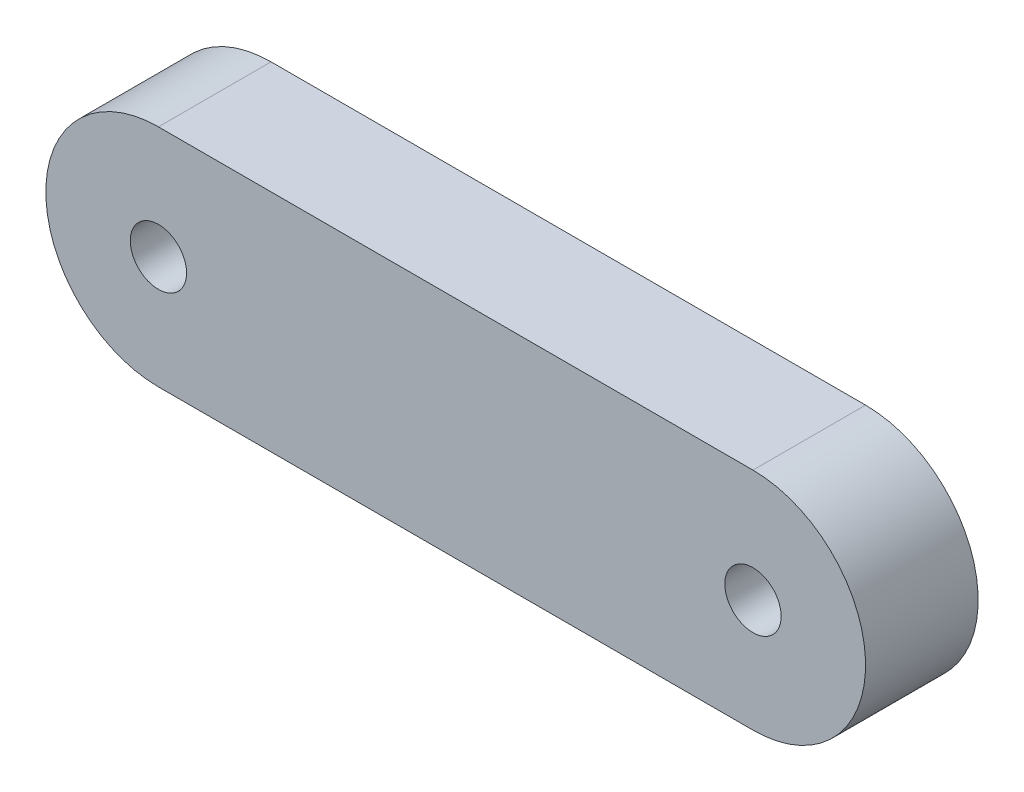
ISO-10303-21;
HEADER;
FILE_DESCRIPTION(('STEP AP214'),'2;1');
FILE_NAME('part.step','',(''),(''),'','','');
FILE_SCHEMA(('AUTOMOTIVE_DESIGN { 1 0 10303 214 1 1 1 1 }'));
ENDSEC;
DATA;
#1=APPLICATION_CONTEXT('core data for automotive mechanical design processes');
#2=APPLICATION_PROTOCOL_DEFINITION('international standard','automotive_design',2000,#1);
#3=PRODUCT_CONTEXT('',#1,'mechanical');
#4=PRODUCT('Part','Part','',(#3));
#5=PRODUCT_RELATED_PRODUCT_CATEGORY('part','',(#4));
#6=PRODUCT_DEFINITION_FORMATION('','',#4);
#7=PRODUCT_DEFINITION_CONTEXT('part definition',#1,'design');
#8=PRODUCT_DEFINITION('design','',#6,#7);
#9=PRODUCT_DEFINITION_SHAPE('','',#8);
#10=(LENGTH_UNIT() NAMED_UNIT(*) SI_UNIT(.MILLI.,.METRE.));
#11=(NAMED_UNIT(*) PLANE_ANGLE_UNIT() SI_UNIT($,.RADIAN.));
#12=(NAMED_UNIT(*) SI_UNIT($,.STERADIAN.) SOLID_ANGLE_UNIT());
#13=UNCERTAINTY_MEASURE_WITH_UNIT(LENGTH_MEASURE(1.E-05),#10,'distance_accuracy_value','');
#14=(GEOMETRIC_REPRESENTATION_CONTEXT(3) GLOBAL_UNCERTAINTY_ASSIGNED_CONTEXT((#13)) GLOBAL_UNIT_ASSIGNED_CONTEXT((#10,
#11,#12)) REPRESENTATION_CONTEXT('',''));
#15=CARTESIAN_POINT('',(0.,0.,0.));
#16=DIRECTION('',(0.,0.,1.));
#17=DIRECTION('',(1.,0.,0.));
#18=AXIS2_PLACEMENT_3D('',#15,#16,#17);
#19=CARTESIAN_POINT('',(0.,-6.35,6.35));
#20=DIRECTION('',(0.,1.,0.));
#21=DIRECTION('',(-1.,0.,0.));
#22=AXIS2_PLACEMENT_3D('',#19,#20,#21);
#23=PLANE('',#22);
#24=DIRECTION('',(1.,0.,0.));
#25=VECTOR('',#24,1.);
#26=CARTESIAN_POINT('',(0.,-6.35,0.));
#27=LINE('',#26,#25);
#28=CARTESIAN_POINT('',(0.,-6.35,0.));
#29=VERTEX_POINT('',#28);
#30=CARTESIAN_POINT('',(33.528,-6.35,0.));
#31=VERTEX_POINT('',#30);
#32=EDGE_CURVE('E104',#29,#31,#27,.T.);
#33=ORIENTED_EDGE('',*,*,#32,.T.);
#34=DIRECTION('',(0.,0.,-1.));
#35=VECTOR('',#34,1.);
#36=CARTESIAN_POINT('',(33.528,-6.35,6.35));
#37=LINE('',#36,#35);
#38=CARTESIAN_POINT('',(33.528,-6.35,6.35));
#39=VERTEX_POINT('',#38);
#40=EDGE_CURVE('E11',#39,#31,#37,.T.);
#41=ORIENTED_EDGE('',*,*,#40,.F.);
#42=DIRECTION('',(1.,0.,0.));
#43=VECTOR('',#42,1.);
#44=CARTESIAN_POINT('',(0.,-6.35,6.35));
#45=LINE('',#44,#43);
#46=CARTESIAN_POINT('',(0.,-6.35,6.35));
#47=VERTEX_POINT('',#46);
#48=EDGE_CURVE('E83',#47,#39,#45,.T.);
#49=ORIENTED_EDGE('',*,*,#48,.F.);
#50=DIRECTION('',(0.,0.,-1.));
#51=VECTOR('',#50,1.);
#52=CARTESIAN_POINT('',(0.,-6.35,6.35));
#53=LINE('',#52,#51);
#54=EDGE_CURVE('E103',#47,#29,#53,.T.);
#55=ORIENTED_EDGE('',*,*,#54,.T.);
#56=EDGE_LOOP('',(#33,#41,#49,#55));
#57=FACE_BOUND('',#56,.T.);
#58=ADVANCED_FACE('F35',(#57),#23,.F.);
#59=CARTESIAN_POINT('',(33.528,0.,6.35));
#60=DIRECTION('',(0.,0.,-1.));
#61=DIRECTION('',(-1.,0.,0.));
#62=AXIS2_PLACEMENT_3D('',#59,#60,#61);
#63=CYLINDRICAL_SURFACE('',#62,6.35);
#64=CARTESIAN_POINT('',(33.528,0.,0.));
#65=DIRECTION('',(0.,0.,1.));
#66=DIRECTION('',(1.,0.,0.));
#67=AXIS2_PLACEMENT_3D('',#64,#65,#66);
#68=CIRCLE('',#67,6.35);
#69=CARTESIAN_POINT('',(33.528,6.35,0.));
#70=VERTEX_POINT('',#69);
#71=EDGE_CURVE('E88',#31,#70,#68,.T.);
#72=ORIENTED_EDGE('',*,*,#71,.T.);
#73=DIRECTION('',(0.,0.,-1.));
#74=VECTOR('',#73,1.);
#75=CARTESIAN_POINT('',(33.528,6.35,6.35));
#76=LINE('',#75,#74);
#77=CARTESIAN_POINT('',(33.528,6.35,6.35));
#78=VERTEX_POINT('',#77);
#79=EDGE_CURVE('E43',#78,#70,#76,.T.);
#80=ORIENTED_EDGE('',*,*,#79,.F.);
#81=CARTESIAN_POINT('',(33.528,0.,6.35));
#82=DIRECTION('',(0.,0.,1.));
#83=DIRECTION('',(1.,0.,0.));
#84=AXIS2_PLACEMENT_3D('',#81,#82,#83);
#85=CIRCLE('',#84,6.35);
#86=EDGE_CURVE('E77',#39,#78,#85,.T.);
#87=ORIENTED_EDGE('',*,*,#86,.F.);
#88=ORIENTED_EDGE('',*,*,#40,.T.);
#89=EDGE_LOOP('',(#72,#80,#87,#88));
#90=FACE_BOUND('',#89,.T.);
#91=ADVANCED_FACE('F87',(#90),#63,.T.);
#92=CARTESIAN_POINT('',(0.,6.35,6.35));
#93=DIRECTION('',(0.,1.,0.));
#94=DIRECTION('',(-1.,0.,0.));
#95=AXIS2_PLACEMENT_3D('',#92,#93,#94);
#96=PLANE('',#95);
#97=DIRECTION('',(1.,0.,0.));
#98=VECTOR('',#97,1.);
#99=CARTESIAN_POINT('',(0.,6.35,0.));
#100=LINE('',#99,#98);
#101=CARTESIAN_POINT('',(0.,6.35,0.));
#102=VERTEX_POINT('',#101);
#103=EDGE_CURVE('E108',#102,#70,#100,.T.);
#104=ORIENTED_EDGE('',*,*,#103,.F.);
#105=DIRECTION('',(0.,0.,-1.));
#106=VECTOR('',#105,1.);
#107=CARTESIAN_POINT('',(0.,6.35,6.35));
#108=LINE('',#107,#106);
#109=CARTESIAN_POINT('',(0.,6.35,6.35));
#110=VERTEX_POINT('',#109);
#111=EDGE_CURVE('E67',#110,#102,#108,.T.);
#112=ORIENTED_EDGE('',*,*,#111,.F.);
#113=DIRECTION('',(1.,0.,0.));
#114=VECTOR('',#113,1.);
#115=CARTESIAN_POINT('',(0.,6.35,6.35));
#116=LINE('',#115,#114);
#117=EDGE_CURVE('E81',#110,#78,#116,.T.);
#118=ORIENTED_EDGE('',*,*,#117,.T.);
#119=ORIENTED_EDGE('',*,*,#79,.T.);
#120=EDGE_LOOP('',(#104,#112,#118,#119));
#121=FACE_BOUND('',#120,.T.);
#122=ADVANCED_FACE('F92',(#121),#96,.T.);
#123=CARTESIAN_POINT('',(0.,0.,6.35));
#124=DIRECTION('',(0.,0.,-1.));
#125=DIRECTION('',(-1.,0.,0.));
#126=AXIS2_PLACEMENT_3D('',#123,#124,#125);
#127=CYLINDRICAL_SURFACE('',#126,1.5875);
#128=CARTESIAN_POINT('',(0.,0.,6.35));
#129=DIRECTION('',(0.,0.,1.));
#130=DIRECTION('',(1.,0.,0.));
#131=AXIS2_PLACEMENT_3D('',#128,#129,#130);
#132=CIRCLE('',#131,1.5875);
#133=CARTESIAN_POINT('',(1.5875,0.,6.35));
#134=VERTEX_POINT('',#133);
#135=EDGE_CURVE('E94',#134,#134,#132,.T.);
#136=ORIENTED_EDGE('',*,*,#135,.T.);
#137=EDGE_LOOP('',(#136));
#138=FACE_BOUND('',#137,.T.);
#139=CARTESIAN_POINT('',(0.,0.,0.));
#140=DIRECTION('',(0.,0.,1.));
#141=DIRECTION('',(1.,0.,0.));
#142=AXIS2_PLACEMENT_3D('',#139,#140,#141);
#143=CIRCLE('',#142,1.5875);
#144=CARTESIAN_POINT('',(1.5875,0.,0.));
#145=VERTEX_POINT('',#144);
#146=EDGE_CURVE('E111',#145,#145,#143,.T.);
#147=ORIENTED_EDGE('',*,*,#146,.F.);
#148=EDGE_LOOP('',(#147));
#149=FACE_BOUND('',#148,.T.);
#150=ADVANCED_FACE('F139',(#138,#149),#127,.F.);
#151=CARTESIAN_POINT('',(0.,0.,6.35));
#152=DIRECTION('',(0.,0.,-1.));
#153=DIRECTION('',(-1.,0.,0.));
#154=AXIS2_PLACEMENT_3D('',#151,#152,#153);
#155=CYLINDRICAL_SURFACE('',#154,6.35);
#156=CARTESIAN_POINT('',(0.,0.,0.));
#157=DIRECTION('',(0.,0.,1.));
#158=DIRECTION('',(1.,0.,0.));
#159=AXIS2_PLACEMENT_3D('',#156,#157,#158);
#160=CIRCLE('',#159,6.35);
#161=EDGE_CURVE('E70',#102,#29,#160,.T.);
#162=ORIENTED_EDGE('',*,*,#161,.T.);
#163=ORIENTED_EDGE('',*,*,#54,.F.);
#164=CARTESIAN_POINT('',(0.,0.,6.35));
#165=DIRECTION('',(0.,0.,1.));
#166=DIRECTION('',(1.,0.,0.));
#167=AXIS2_PLACEMENT_3D('',#164,#165,#166);
#168=CIRCLE('',#167,6.35);
#169=EDGE_CURVE('E51',#110,#47,#168,.T.);
#170=ORIENTED_EDGE('',*,*,#169,.F.);
#171=ORIENTED_EDGE('',*,*,#111,.T.);
#172=EDGE_LOOP('',(#162,#163,#170,#171));
#173=FACE_BOUND('',#172,.T.);
#174=ADVANCED_FACE('F131',(#173),#155,.T.);
#175=CARTESIAN_POINT('',(33.528,0.,6.35));
#176=DIRECTION('',(0.,0.,-1.));
#177=DIRECTION('',(-1.,0.,0.));
#178=AXIS2_PLACEMENT_3D('',#175,#176,#177);
#179=CYLINDRICAL_SURFACE('',#178,1.5875);
#180=CARTESIAN_POINT('',(33.528,0.,6.35));
#181=DIRECTION('',(0.,0.,1.));
#182=DIRECTION('',(1.,0.,0.));
#183=AXIS2_PLACEMENT_3D('',#180,#181,#182);
#184=CIRCLE('',#183,1.5875);
#185=CARTESIAN_POINT('',(35.1155,0.,6.35));
#186=VERTEX_POINT('',#185);
#187=EDGE_CURVE('E100',#186,#186,#184,.T.);
#188=ORIENTED_EDGE('',*,*,#187,.T.);
#189=EDGE_LOOP('',(#188));
#190=FACE_BOUND('',#189,.T.);
#191=CARTESIAN_POINT('',(33.528,0.,0.));
#192=DIRECTION('',(0.,0.,1.));
#193=DIRECTION('',(1.,0.,0.));
#194=AXIS2_PLACEMENT_3D('',#191,#192,#193);
#195=CIRCLE('',#194,1.5875);
#196=CARTESIAN_POINT('',(35.1155,0.,0.));
#197=VERTEX_POINT('',#196);
#198=EDGE_CURVE('E114',#197,#197,#195,.T.);
#199=ORIENTED_EDGE('',*,*,#198,.F.);
#200=EDGE_LOOP('',(#199));
#201=FACE_BOUND('',#200,.T.);
#202=ADVANCED_FACE('F129',(#190,#201),#179,.F.);
#203=CARTESIAN_POINT('',(0.,0.,6.35));
#204=DIRECTION('',(0.,0.,1.));
#205=DIRECTION('',(1.,0.,0.));
#206=AXIS2_PLACEMENT_3D('',#203,#204,#205);
#207=PLANE('',#206);
#208=ORIENTED_EDGE('',*,*,#48,.T.);
#209=ORIENTED_EDGE('',*,*,#86,.T.);
#210=ORIENTED_EDGE('',*,*,#117,.F.);
#211=ORIENTED_EDGE('',*,*,#169,.T.);
#212=EDGE_LOOP('',(#208,#209,#210,#211));
#213=FACE_BOUND('',#212,.T.);
#214=ORIENTED_EDGE('',*,*,#135,.F.);
#215=EDGE_LOOP('',(#214));
#216=FACE_BOUND('',#215,.T.);
#217=ORIENTED_EDGE('',*,*,#187,.F.);
#218=EDGE_LOOP('',(#217));
#219=FACE_BOUND('',#218,.T.);
#220=ADVANCED_FACE('F78',(#213,#216,#219),#207,.T.);
#221=CARTESIAN_POINT('',(0.,0.,0.));
#222=DIRECTION('',(0.,0.,1.));
#223=DIRECTION('',(1.,0.,0.));
#224=AXIS2_PLACEMENT_3D('',#221,#222,#223);
#225=PLANE('',#224);
#226=ORIENTED_EDGE('',*,*,#32,.F.);
#227=ORIENTED_EDGE('',*,*,#161,.F.);
#228=ORIENTED_EDGE('',*,*,#103,.T.);
#229=ORIENTED_EDGE('',*,*,#71,.F.);
#230=EDGE_LOOP('',(#226,#227,#228,#229));
#231=FACE_BOUND('',#230,.T.);
#232=ORIENTED_EDGE('',*,*,#146,.T.);
#233=EDGE_LOOP('',(#232));
#234=FACE_BOUND('',#233,.T.);
#235=ORIENTED_EDGE('',*,*,#198,.T.);
#236=EDGE_LOOP('',(#235));
#237=FACE_BOUND('',#236,.T.);
#238=ADVANCED_FACE('F121',(#231,#234,#237),#225,.F.);
#239=CLOSED_SHELL('',(#58,#91,#122,#150,#174,#202,#220,#238));
#240=MANIFOLD_SOLID_BREP('B2',#239);
#241=ADVANCED_BREP_SHAPE_REPRESENTATION('',(#18,#240),#14);
#242=SHAPE_DEFINITION_REPRESENTATION(#9,#241);
ENDSEC;
END-ISO-10303-21;
